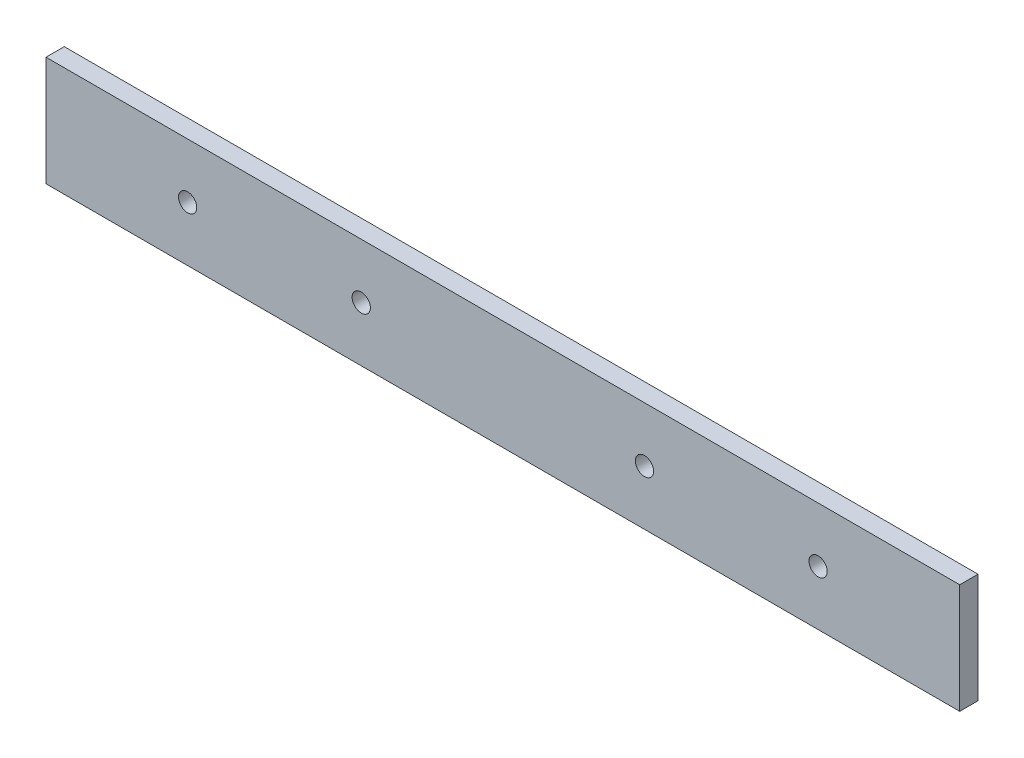
ISO-10303-21;
HEADER;
FILE_DESCRIPTION(('STEP AP214'),'2;1');
FILE_NAME('part.step','',(''),(''),'','','');
FILE_SCHEMA(('AUTOMOTIVE_DESIGN { 1 0 10303 214 1 1 1 1 }'));
ENDSEC;
DATA;
#1=APPLICATION_CONTEXT('core data for automotive mechanical design processes');
#2=APPLICATION_PROTOCOL_DEFINITION('international standard','automotive_design',2000,#1);
#3=PRODUCT_CONTEXT('',#1,'mechanical');
#4=PRODUCT('Part','Part','',(#3));
#5=PRODUCT_RELATED_PRODUCT_CATEGORY('part','',(#4));
#6=PRODUCT_DEFINITION_FORMATION('','',#4);
#7=PRODUCT_DEFINITION_CONTEXT('part definition',#1,'design');
#8=PRODUCT_DEFINITION('design','',#6,#7);
#9=PRODUCT_DEFINITION_SHAPE('','',#8);
#10=(LENGTH_UNIT() NAMED_UNIT(*) SI_UNIT(.MILLI.,.METRE.));
#11=(NAMED_UNIT(*) PLANE_ANGLE_UNIT() SI_UNIT($,.RADIAN.));
#12=(NAMED_UNIT(*) SI_UNIT($,.STERADIAN.) SOLID_ANGLE_UNIT());
#13=UNCERTAINTY_MEASURE_WITH_UNIT(LENGTH_MEASURE(1.E-05),#10,'distance_accuracy_value','');
#14=(GEOMETRIC_REPRESENTATION_CONTEXT(3) GLOBAL_UNCERTAINTY_ASSIGNED_CONTEXT((#13)) GLOBAL_UNIT_ASSIGNED_CONTEXT((#10,
#11,#12)) REPRESENTATION_CONTEXT('',''));
#15=CARTESIAN_POINT('',(0.,0.,0.));
#16=DIRECTION('',(0.,0.,1.));
#17=DIRECTION('',(1.,0.,0.));
#18=AXIS2_PLACEMENT_3D('',#15,#16,#17);
#19=CARTESIAN_POINT('',(0.,0.,5.));
#20=DIRECTION('',(0.,0.,-1.));
#21=DIRECTION('',(-1.,0.,0.));
#22=AXIS2_PLACEMENT_3D('',#19,#20,#21);
#23=PLANE('',#22);
#24=DIRECTION('',(0.,1.,0.));
#25=VECTOR('',#24,1.);
#26=CARTESIAN_POINT('',(250.,-30.,5.));
#27=LINE('',#26,#25);
#28=CARTESIAN_POINT('',(250.,-30.,5.));
#29=VERTEX_POINT('',#28);
#30=CARTESIAN_POINT('',(250.,30.,5.));
#31=VERTEX_POINT('',#30);
#32=EDGE_CURVE('E85',#29,#31,#27,.T.);
#33=ORIENTED_EDGE('',*,*,#32,.T.);
#34=DIRECTION('',(-1.,0.,0.));
#35=VECTOR('',#34,1.);
#36=CARTESIAN_POINT('',(-250.,30.,5.));
#37=LINE('',#36,#35);
#38=CARTESIAN_POINT('',(-250.,30.,5.));
#39=VERTEX_POINT('',#38);
#40=EDGE_CURVE('E80',#31,#39,#37,.T.);
#41=ORIENTED_EDGE('',*,*,#40,.T.);
#42=DIRECTION('',(0.,-1.,0.));
#43=VECTOR('',#42,1.);
#44=CARTESIAN_POINT('',(-250.,-30.,5.));
#45=LINE('',#44,#43);
#46=CARTESIAN_POINT('',(-250.,-30.,5.));
#47=VERTEX_POINT('',#46);
#48=EDGE_CURVE('E83',#39,#47,#45,.T.);
#49=ORIENTED_EDGE('',*,*,#48,.T.);
#50=DIRECTION('',(1.,0.,0.));
#51=VECTOR('',#50,1.);
#52=CARTESIAN_POINT('',(-250.,-30.,5.));
#53=LINE('',#52,#51);
#54=EDGE_CURVE('E50',#47,#29,#53,.T.);
#55=ORIENTED_EDGE('',*,*,#54,.T.);
#56=EDGE_LOOP('',(#33,#41,#49,#55));
#57=FACE_BOUND('',#56,.T.);
#58=CARTESIAN_POINT('',(172.5,0.,5.));
#59=DIRECTION('',(0.,0.,1.));
#60=DIRECTION('',(1.,0.,0.));
#61=AXIS2_PLACEMENT_3D('',#58,#59,#60);
#62=CIRCLE('',#61,4.99999999999999);
#63=CARTESIAN_POINT('',(177.5,0.,5.));
#64=VERTEX_POINT('',#63);
#65=EDGE_CURVE('E100',#64,#64,#62,.T.);
#66=ORIENTED_EDGE('',*,*,#65,.F.);
#67=EDGE_LOOP('',(#66));
#68=FACE_BOUND('',#67,.T.);
#69=CARTESIAN_POINT('',(77.5,0.,5.));
#70=DIRECTION('',(0.,0.,1.));
#71=DIRECTION('',(1.,0.,0.));
#72=AXIS2_PLACEMENT_3D('',#69,#70,#71);
#73=CIRCLE('',#72,5.);
#74=CARTESIAN_POINT('',(82.5,0.,5.));
#75=VERTEX_POINT('',#74);
#76=EDGE_CURVE('E115',#75,#75,#73,.T.);
#77=ORIENTED_EDGE('',*,*,#76,.F.);
#78=EDGE_LOOP('',(#77));
#79=FACE_BOUND('',#78,.T.);
#80=CARTESIAN_POINT('',(-172.5,0.,5.));
#81=DIRECTION('',(0.,0.,1.));
#82=DIRECTION('',(-1.,0.,0.));
#83=AXIS2_PLACEMENT_3D('',#80,#81,#82);
#84=CIRCLE('',#83,4.99999999999999);
#85=CARTESIAN_POINT('',(-177.5,0.,5.));
#86=VERTEX_POINT('',#85);
#87=EDGE_CURVE('E121',#86,#86,#84,.T.);
#88=ORIENTED_EDGE('',*,*,#87,.F.);
#89=EDGE_LOOP('',(#88));
#90=FACE_BOUND('',#89,.T.);
#91=CARTESIAN_POINT('',(-77.5,0.,5.));
#92=DIRECTION('',(0.,0.,1.));
#93=DIRECTION('',(-1.,0.,0.));
#94=AXIS2_PLACEMENT_3D('',#91,#92,#93);
#95=CIRCLE('',#94,5.);
#96=CARTESIAN_POINT('',(-82.5,0.,5.));
#97=VERTEX_POINT('',#96);
#98=EDGE_CURVE('E127',#97,#97,#95,.T.);
#99=ORIENTED_EDGE('',*,*,#98,.F.);
#100=EDGE_LOOP('',(#99));
#101=FACE_BOUND('',#100,.T.);
#102=ADVANCED_FACE('F33',(#57,#68,#79,#90,#101),#23,.F.);
#103=CARTESIAN_POINT('',(0.,0.,-5.));
#104=DIRECTION('',(0.,0.,-1.));
#105=DIRECTION('',(-1.,0.,0.));
#106=AXIS2_PLACEMENT_3D('',#103,#104,#105);
#107=PLANE('',#106);
#108=CARTESIAN_POINT('',(-172.5,0.,-5.));
#109=DIRECTION('',(0.,0.,1.));
#110=DIRECTION('',(-1.,0.,0.));
#111=AXIS2_PLACEMENT_3D('',#108,#109,#110);
#112=CIRCLE('',#111,4.99999999999999);
#113=CARTESIAN_POINT('',(-177.5,0.,-5.));
#114=VERTEX_POINT('',#113);
#115=EDGE_CURVE('E124',#114,#114,#112,.T.);
#116=ORIENTED_EDGE('',*,*,#115,.T.);
#117=EDGE_LOOP('',(#116));
#118=FACE_BOUND('',#117,.T.);
#119=CARTESIAN_POINT('',(172.5,0.,-5.));
#120=DIRECTION('',(0.,0.,1.));
#121=DIRECTION('',(1.,0.,0.));
#122=AXIS2_PLACEMENT_3D('',#119,#120,#121);
#123=CIRCLE('',#122,4.99999999999999);
#124=CARTESIAN_POINT('',(177.5,0.,-5.));
#125=VERTEX_POINT('',#124);
#126=EDGE_CURVE('E112',#125,#125,#123,.T.);
#127=ORIENTED_EDGE('',*,*,#126,.T.);
#128=EDGE_LOOP('',(#127));
#129=FACE_BOUND('',#128,.T.);
#130=DIRECTION('',(0.,1.,0.));
#131=VECTOR('',#130,1.);
#132=CARTESIAN_POINT('',(250.,-30.,-5.));
#133=LINE('',#132,#131);
#134=CARTESIAN_POINT('',(250.,-30.,-5.));
#135=VERTEX_POINT('',#134);
#136=CARTESIAN_POINT('',(250.,30.,-5.));
#137=VERTEX_POINT('',#136);
#138=EDGE_CURVE('E97',#135,#137,#133,.T.);
#139=ORIENTED_EDGE('',*,*,#138,.F.);
#140=DIRECTION('',(1.,0.,0.));
#141=VECTOR('',#140,1.);
#142=CARTESIAN_POINT('',(-250.,-30.,-5.));
#143=LINE('',#142,#141);
#144=CARTESIAN_POINT('',(-250.,-30.,-5.));
#145=VERTEX_POINT('',#144);
#146=EDGE_CURVE('E73',#145,#135,#143,.T.);
#147=ORIENTED_EDGE('',*,*,#146,.F.);
#148=DIRECTION('',(0.,-1.,0.));
#149=VECTOR('',#148,1.);
#150=CARTESIAN_POINT('',(-250.,-30.,-5.));
#151=LINE('',#150,#149);
#152=CARTESIAN_POINT('',(-250.,30.,-5.));
#153=VERTEX_POINT('',#152);
#154=EDGE_CURVE('E67',#153,#145,#151,.T.);
#155=ORIENTED_EDGE('',*,*,#154,.F.);
#156=DIRECTION('',(-1.,0.,0.));
#157=VECTOR('',#156,1.);
#158=CARTESIAN_POINT('',(-250.,30.,-5.));
#159=LINE('',#158,#157);
#160=EDGE_CURVE('E89',#137,#153,#159,.T.);
#161=ORIENTED_EDGE('',*,*,#160,.F.);
#162=EDGE_LOOP('',(#139,#147,#155,#161));
#163=FACE_BOUND('',#162,.T.);
#164=CARTESIAN_POINT('',(77.5,0.,-5.));
#165=DIRECTION('',(0.,0.,1.));
#166=DIRECTION('',(1.,0.,0.));
#167=AXIS2_PLACEMENT_3D('',#164,#165,#166);
#168=CIRCLE('',#167,5.);
#169=CARTESIAN_POINT('',(82.5,0.,-5.));
#170=VERTEX_POINT('',#169);
#171=EDGE_CURVE('E118',#170,#170,#168,.T.);
#172=ORIENTED_EDGE('',*,*,#171,.T.);
#173=EDGE_LOOP('',(#172));
#174=FACE_BOUND('',#173,.T.);
#175=CARTESIAN_POINT('',(-77.5,0.,-5.));
#176=DIRECTION('',(0.,0.,1.));
#177=DIRECTION('',(-1.,0.,0.));
#178=AXIS2_PLACEMENT_3D('',#175,#176,#177);
#179=CIRCLE('',#178,5.);
#180=CARTESIAN_POINT('',(-82.5,0.,-5.));
#181=VERTEX_POINT('',#180);
#182=EDGE_CURVE('E130',#181,#181,#179,.T.);
#183=ORIENTED_EDGE('',*,*,#182,.T.);
#184=EDGE_LOOP('',(#183));
#185=FACE_BOUND('',#184,.T.);
#186=ADVANCED_FACE('F108',(#118,#129,#163,#174,#185),#107,.T.);
#187=CARTESIAN_POINT('',(250.,-30.,5.));
#188=DIRECTION('',(-1.,0.,0.));
#189=DIRECTION('',(0.,0.,1.));
#190=AXIS2_PLACEMENT_3D('',#187,#188,#189);
#191=PLANE('',#190);
#192=ORIENTED_EDGE('',*,*,#138,.T.);
#193=DIRECTION('',(0.,0.,-1.));
#194=VECTOR('',#193,1.);
#195=CARTESIAN_POINT('',(250.,30.,5.));
#196=LINE('',#195,#194);
#197=EDGE_CURVE('E11',#31,#137,#196,.T.);
#198=ORIENTED_EDGE('',*,*,#197,.F.);
#199=ORIENTED_EDGE('',*,*,#32,.F.);
#200=DIRECTION('',(0.,0.,-1.));
#201=VECTOR('',#200,1.);
#202=CARTESIAN_POINT('',(250.,-30.,5.));
#203=LINE('',#202,#201);
#204=EDGE_CURVE('E93',#29,#135,#203,.T.);
#205=ORIENTED_EDGE('',*,*,#204,.T.);
#206=EDGE_LOOP('',(#192,#198,#199,#205));
#207=FACE_BOUND('',#206,.T.);
#208=ADVANCED_FACE('F35',(#207),#191,.F.);
#209=CARTESIAN_POINT('',(-250.,30.,5.));
#210=DIRECTION('',(0.,-1.,0.));
#211=DIRECTION('',(0.,0.,-1.));
#212=AXIS2_PLACEMENT_3D('',#209,#210,#211);
#213=PLANE('',#212);
#214=ORIENTED_EDGE('',*,*,#160,.T.);
#215=DIRECTION('',(0.,0.,-1.));
#216=VECTOR('',#215,1.);
#217=CARTESIAN_POINT('',(-250.,30.,5.));
#218=LINE('',#217,#216);
#219=EDGE_CURVE('E42',#39,#153,#218,.T.);
#220=ORIENTED_EDGE('',*,*,#219,.F.);
#221=ORIENTED_EDGE('',*,*,#40,.F.);
#222=ORIENTED_EDGE('',*,*,#197,.T.);
#223=EDGE_LOOP('',(#214,#220,#221,#222));
#224=FACE_BOUND('',#223,.T.);
#225=ADVANCED_FACE('F88',(#224),#213,.F.);
#226=CARTESIAN_POINT('',(-250.,-30.,5.));
#227=DIRECTION('',(1.,0.,0.));
#228=DIRECTION('',(0.,0.,-1.));
#229=AXIS2_PLACEMENT_3D('',#226,#227,#228);
#230=PLANE('',#229);
#231=ORIENTED_EDGE('',*,*,#154,.T.);
#232=DIRECTION('',(0.,0.,-1.));
#233=VECTOR('',#232,1.);
#234=CARTESIAN_POINT('',(-250.,-30.,5.));
#235=LINE('',#234,#233);
#236=EDGE_CURVE('E90',#47,#145,#235,.T.);
#237=ORIENTED_EDGE('',*,*,#236,.F.);
#238=ORIENTED_EDGE('',*,*,#48,.F.);
#239=ORIENTED_EDGE('',*,*,#219,.T.);
#240=EDGE_LOOP('',(#231,#237,#238,#239));
#241=FACE_BOUND('',#240,.T.);
#242=ADVANCED_FACE('F91',(#241),#230,.F.);
#243=CARTESIAN_POINT('',(-250.,-30.,5.));
#244=DIRECTION('',(0.,1.,0.));
#245=DIRECTION('',(0.,0.,1.));
#246=AXIS2_PLACEMENT_3D('',#243,#244,#245);
#247=PLANE('',#246);
#248=ORIENTED_EDGE('',*,*,#146,.T.);
#249=ORIENTED_EDGE('',*,*,#204,.F.);
#250=ORIENTED_EDGE('',*,*,#54,.F.);
#251=ORIENTED_EDGE('',*,*,#236,.T.);
#252=EDGE_LOOP('',(#248,#249,#250,#251));
#253=FACE_BOUND('',#252,.T.);
#254=ADVANCED_FACE('F105',(#253),#247,.F.);
#255=CARTESIAN_POINT('',(172.5,0.,5.));
#256=DIRECTION('',(0.,0.,-1.));
#257=DIRECTION('',(-1.,0.,0.));
#258=AXIS2_PLACEMENT_3D('',#255,#256,#257);
#259=CYLINDRICAL_SURFACE('',#258,4.99999999999999);
#260=ORIENTED_EDGE('',*,*,#65,.T.);
#261=EDGE_LOOP('',(#260));
#262=FACE_BOUND('',#261,.T.);
#263=ORIENTED_EDGE('',*,*,#126,.F.);
#264=EDGE_LOOP('',(#263));
#265=FACE_BOUND('',#264,.T.);
#266=ADVANCED_FACE('F147',(#262,#265),#259,.F.);
#267=CARTESIAN_POINT('',(77.5,0.,5.));
#268=DIRECTION('',(0.,0.,-1.));
#269=DIRECTION('',(-1.,0.,0.));
#270=AXIS2_PLACEMENT_3D('',#267,#268,#269);
#271=CYLINDRICAL_SURFACE('',#270,5.);
#272=ORIENTED_EDGE('',*,*,#76,.T.);
#273=EDGE_LOOP('',(#272));
#274=FACE_BOUND('',#273,.T.);
#275=ORIENTED_EDGE('',*,*,#171,.F.);
#276=EDGE_LOOP('',(#275));
#277=FACE_BOUND('',#276,.T.);
#278=ADVANCED_FACE('F193',(#274,#277),#271,.F.);
#279=CARTESIAN_POINT('',(-172.5,0.,5.));
#280=DIRECTION('',(0.,0.,-1.));
#281=DIRECTION('',(-1.,0.,0.));
#282=AXIS2_PLACEMENT_3D('',#279,#280,#281);
#283=CYLINDRICAL_SURFACE('',#282,4.99999999999999);
#284=ORIENTED_EDGE('',*,*,#87,.T.);
#285=EDGE_LOOP('',(#284));
#286=FACE_BOUND('',#285,.T.);
#287=ORIENTED_EDGE('',*,*,#115,.F.);
#288=EDGE_LOOP('',(#287));
#289=FACE_BOUND('',#288,.T.);
#290=ADVANCED_FACE('F201',(#286,#289),#283,.F.);
#291=CARTESIAN_POINT('',(-77.5,0.,5.));
#292=DIRECTION('',(0.,0.,-1.));
#293=DIRECTION('',(-1.,0.,0.));
#294=AXIS2_PLACEMENT_3D('',#291,#292,#293);
#295=CYLINDRICAL_SURFACE('',#294,5.);
#296=ORIENTED_EDGE('',*,*,#98,.T.);
#297=EDGE_LOOP('',(#296));
#298=FACE_BOUND('',#297,.T.);
#299=ORIENTED_EDGE('',*,*,#182,.F.);
#300=EDGE_LOOP('',(#299));
#301=FACE_BOUND('',#300,.T.);
#302=ADVANCED_FACE('F136',(#298,#301),#295,.F.);
#303=CLOSED_SHELL('',(#102,#186,#208,#225,#242,#254,#266,#278,#290,#302));
#304=MANIFOLD_SOLID_BREP('B2',#303);
#305=ADVANCED_BREP_SHAPE_REPRESENTATION('',(#18,#304),#14);
#306=SHAPE_DEFINITION_REPRESENTATION(#9,#305);
ENDSEC;
END-ISO-10303-21;
